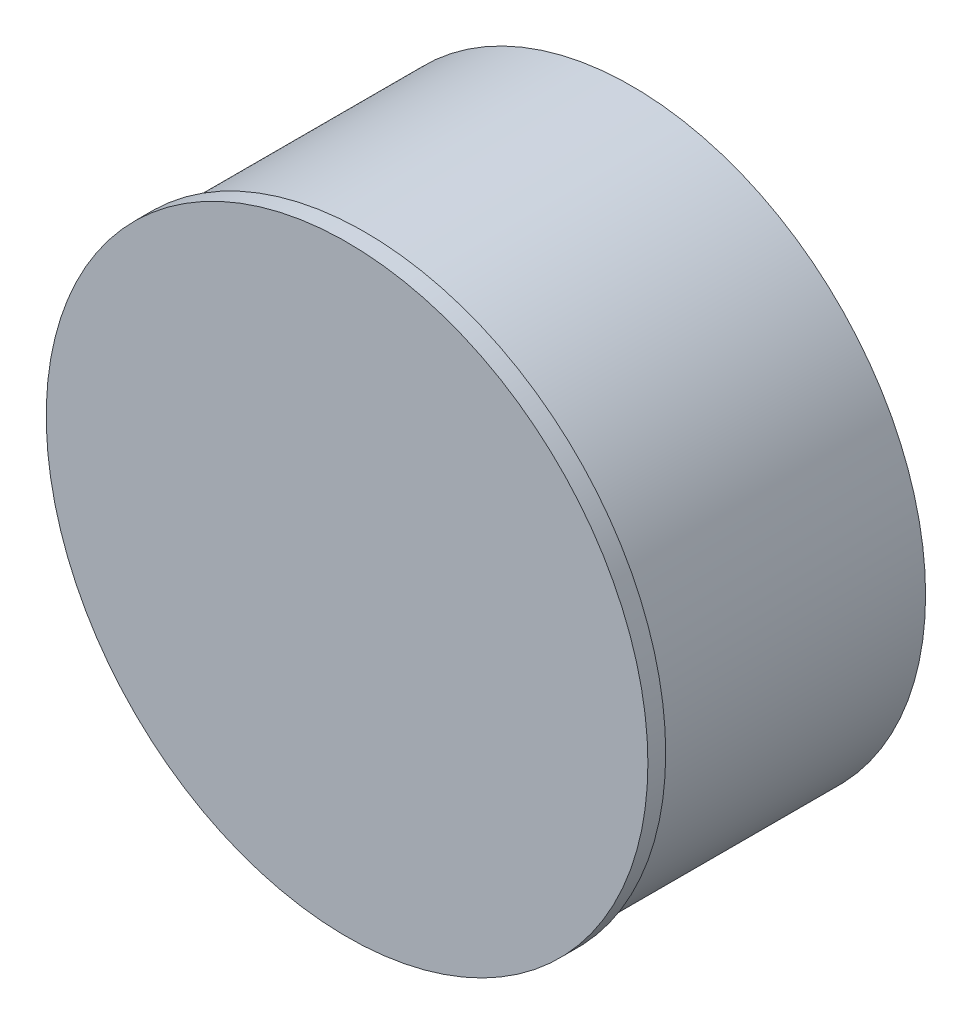
ISO-10303-21;
HEADER;
FILE_DESCRIPTION(('STEP AP214'),'2;1');
FILE_NAME('part.step','',(''),(''),'','','');
FILE_SCHEMA(('AUTOMOTIVE_DESIGN { 1 0 10303 214 1 1 1 1 }'));
ENDSEC;
DATA;
#1=APPLICATION_CONTEXT('core data for automotive mechanical design processes');
#2=APPLICATION_PROTOCOL_DEFINITION('international standard','automotive_design',2000,#1);
#3=PRODUCT_CONTEXT('',#1,'mechanical');
#4=PRODUCT('Part','Part','',(#3));
#5=PRODUCT_RELATED_PRODUCT_CATEGORY('part','',(#4));
#6=PRODUCT_DEFINITION_FORMATION('','',#4);
#7=PRODUCT_DEFINITION_CONTEXT('part definition',#1,'design');
#8=PRODUCT_DEFINITION('design','',#6,#7);
#9=PRODUCT_DEFINITION_SHAPE('','',#8);
#10=(LENGTH_UNIT() NAMED_UNIT(*) SI_UNIT(.MILLI.,.METRE.));
#11=(NAMED_UNIT(*) PLANE_ANGLE_UNIT() SI_UNIT($,.RADIAN.));
#12=(NAMED_UNIT(*) SI_UNIT($,.STERADIAN.) SOLID_ANGLE_UNIT());
#13=UNCERTAINTY_MEASURE_WITH_UNIT(LENGTH_MEASURE(1.E-05),#10,'distance_accuracy_value','');
#14=(GEOMETRIC_REPRESENTATION_CONTEXT(3) GLOBAL_UNCERTAINTY_ASSIGNED_CONTEXT((#13)) GLOBAL_UNIT_ASSIGNED_CONTEXT((#10,
#11,#12)) REPRESENTATION_CONTEXT('',''));
#15=CARTESIAN_POINT('',(0.,0.,0.));
#16=DIRECTION('',(0.,0.,1.));
#17=DIRECTION('',(1.,0.,0.));
#18=AXIS2_PLACEMENT_3D('',#15,#16,#17);
#19=CARTESIAN_POINT('',(0.,0.,80.));
#20=DIRECTION('',(0.,0.,1.));
#21=DIRECTION('',(1.,0.,0.));
#22=AXIS2_PLACEMENT_3D('',#19,#20,#21);
#23=PLANE('',#22);
#24=CARTESIAN_POINT('',(0.,0.,80.));
#25=DIRECTION('',(0.,0.,1.));
#26=DIRECTION('',(1.,0.,0.));
#27=AXIS2_PLACEMENT_3D('',#24,#25,#26);
#28=CIRCLE('',#27,84.5);
#29=CARTESIAN_POINT('',(84.5,0.,80.));
#30=VERTEX_POINT('',#29);
#31=EDGE_CURVE('E18',#30,#30,#28,.F.);
#32=ORIENTED_EDGE('',*,*,#31,.F.);
#33=EDGE_LOOP('',(#32));
#34=FACE_BOUND('',#33,.T.);
#35=ADVANCED_FACE('F15',(#34),#23,.T.);
#36=CARTESIAN_POINT('',(0.,0.,75.));
#37=DIRECTION('',(0.,0.,-1.));
#38=DIRECTION('',(-1.,0.,0.));
#39=AXIS2_PLACEMENT_3D('',#36,#37,#38);
#40=PLANE('',#39);
#41=CARTESIAN_POINT('',(0.,0.,75.));
#42=DIRECTION('',(0.,0.,1.));
#43=DIRECTION('',(1.,0.,0.));
#44=AXIS2_PLACEMENT_3D('',#41,#42,#43);
#45=CIRCLE('',#44,78.);
#46=CARTESIAN_POINT('',(78.,0.,75.));
#47=VERTEX_POINT('',#46);
#48=EDGE_CURVE('E34',#47,#47,#45,.F.);
#49=ORIENTED_EDGE('',*,*,#48,.T.);
#50=EDGE_LOOP('',(#49));
#51=FACE_BOUND('',#50,.T.);
#52=ADVANCED_FACE('F44',(#51),#40,.T.);
#53=CARTESIAN_POINT('',(0.,0.,80.));
#54=DIRECTION('',(0.,0.,1.));
#55=DIRECTION('',(1.,0.,0.));
#56=AXIS2_PLACEMENT_3D('',#53,#54,#55);
#57=CYLINDRICAL_SURFACE('',#56,84.5);
#58=CARTESIAN_POINT('',(0.,0.,75.));
#59=DIRECTION('',(0.,0.,1.));
#60=DIRECTION('',(1.,0.,0.));
#61=AXIS2_PLACEMENT_3D('',#58,#59,#60);
#62=CIRCLE('',#61,84.5);
#63=CARTESIAN_POINT('',(84.5,0.,75.));
#64=VERTEX_POINT('',#63);
#65=EDGE_CURVE('E32',#64,#64,#62,.F.);
#66=ORIENTED_EDGE('',*,*,#65,.F.);
#67=EDGE_LOOP('',(#66));
#68=FACE_BOUND('',#67,.T.);
#69=ORIENTED_EDGE('',*,*,#31,.T.);
#70=EDGE_LOOP('',(#69));
#71=FACE_BOUND('',#70,.T.);
#72=ADVANCED_FACE('F41',(#68,#71),#57,.T.);
#73=CARTESIAN_POINT('',(0.,0.,75.));
#74=DIRECTION('',(0.,0.,1.));
#75=DIRECTION('',(1.,0.,0.));
#76=AXIS2_PLACEMENT_3D('',#73,#74,#75);
#77=CYLINDRICAL_SURFACE('',#76,78.);
#78=CARTESIAN_POINT('',(0.,0.,0.));
#79=DIRECTION('',(0.,0.,1.));
#80=DIRECTION('',(1.,0.,0.));
#81=AXIS2_PLACEMENT_3D('',#78,#79,#80);
#82=CIRCLE('',#81,78.);
#83=CARTESIAN_POINT('',(78.,0.,0.));
#84=VERTEX_POINT('',#83);
#85=EDGE_CURVE('E27',#84,#84,#82,.F.);
#86=ORIENTED_EDGE('',*,*,#85,.T.);
#87=EDGE_LOOP('',(#86));
#88=FACE_BOUND('',#87,.T.);
#89=ORIENTED_EDGE('',*,*,#48,.F.);
#90=EDGE_LOOP('',(#89));
#91=FACE_BOUND('',#90,.T.);
#92=ADVANCED_FACE('F63',(#88,#91),#77,.F.);
#93=CARTESIAN_POINT('',(0.,0.,75.));
#94=DIRECTION('',(0.,0.,-1.));
#95=DIRECTION('',(-1.,0.,0.));
#96=AXIS2_PLACEMENT_3D('',#93,#94,#95);
#97=PLANE('',#96);
#98=ORIENTED_EDGE('',*,*,#65,.T.);
#99=EDGE_LOOP('',(#98));
#100=FACE_BOUND('',#99,.T.);
#101=CARTESIAN_POINT('',(0.,0.,75.));
#102=DIRECTION('',(0.,0.,1.));
#103=DIRECTION('',(1.,0.,0.));
#104=AXIS2_PLACEMENT_3D('',#101,#102,#103);
#105=CIRCLE('',#104,82.5);
#106=CARTESIAN_POINT('',(82.5,0.,75.));
#107=VERTEX_POINT('',#106);
#108=EDGE_CURVE('E22',#107,#107,#105,.F.);
#109=ORIENTED_EDGE('',*,*,#108,.F.);
#110=EDGE_LOOP('',(#109));
#111=FACE_BOUND('',#110,.T.);
#112=ADVANCED_FACE('F56',(#100,#111),#97,.T.);
#113=CARTESIAN_POINT('',(0.,0.,0.));
#114=DIRECTION('',(0.,0.,1.));
#115=DIRECTION('',(1.,0.,0.));
#116=AXIS2_PLACEMENT_3D('',#113,#114,#115);
#117=PLANE('',#116);
#118=CARTESIAN_POINT('',(0.,0.,0.));
#119=DIRECTION('',(0.,0.,1.));
#120=DIRECTION('',(1.,0.,0.));
#121=AXIS2_PLACEMENT_3D('',#118,#119,#120);
#122=CIRCLE('',#121,82.5);
#123=CARTESIAN_POINT('',(82.5,0.,0.));
#124=VERTEX_POINT('',#123);
#125=EDGE_CURVE('E10',#124,#124,#122,.T.);
#126=ORIENTED_EDGE('',*,*,#125,.F.);
#127=EDGE_LOOP('',(#126));
#128=FACE_BOUND('',#127,.T.);
#129=ORIENTED_EDGE('',*,*,#85,.F.);
#130=EDGE_LOOP('',(#129));
#131=FACE_BOUND('',#130,.T.);
#132=ADVANCED_FACE('F51',(#128,#131),#117,.F.);
#133=CARTESIAN_POINT('',(0.,0.,75.));
#134=DIRECTION('',(0.,0.,1.));
#135=DIRECTION('',(1.,0.,0.));
#136=AXIS2_PLACEMENT_3D('',#133,#134,#135);
#137=CYLINDRICAL_SURFACE('',#136,82.5);
#138=ORIENTED_EDGE('',*,*,#125,.T.);
#139=EDGE_LOOP('',(#138));
#140=FACE_BOUND('',#139,.T.);
#141=ORIENTED_EDGE('',*,*,#108,.T.);
#142=EDGE_LOOP('',(#141));
#143=FACE_BOUND('',#142,.T.);
#144=ADVANCED_FACE('F49',(#140,#143),#137,.T.);
#145=CLOSED_SHELL('',(#35,#52,#72,#92,#112,#132,#144));
#146=MANIFOLD_SOLID_BREP('B1',#145);
#147=ADVANCED_BREP_SHAPE_REPRESENTATION('',(#18,#146),#14);
#148=SHAPE_DEFINITION_REPRESENTATION(#9,#147);
ENDSEC;
END-ISO-10303-21;
